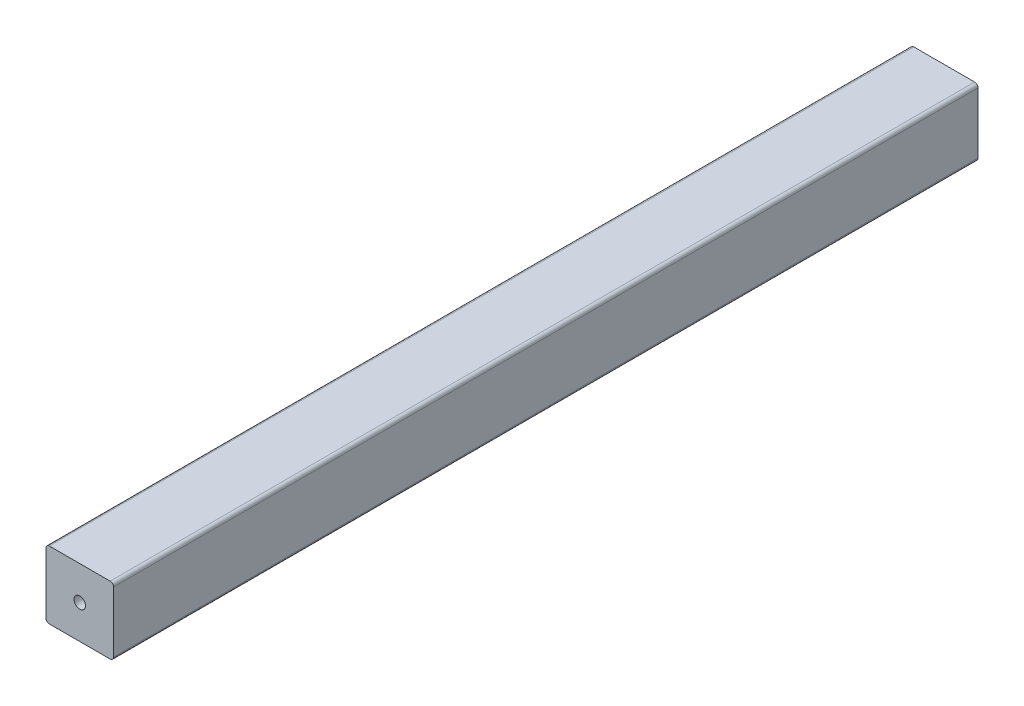
ISO-10303-21;
HEADER;
FILE_DESCRIPTION(('STEP AP214'),'2;1');
FILE_NAME('part.step','',(''),(''),'','','');
FILE_SCHEMA(('AUTOMOTIVE_DESIGN { 1 0 10303 214 1 1 1 1 }'));
ENDSEC;
DATA;
#1=APPLICATION_CONTEXT('core data for automotive mechanical design processes');
#2=APPLICATION_PROTOCOL_DEFINITION('international standard','automotive_design',2000,#1);
#3=PRODUCT_CONTEXT('',#1,'mechanical');
#4=PRODUCT('Part','Part','',(#3));
#5=PRODUCT_RELATED_PRODUCT_CATEGORY('part','',(#4));
#6=PRODUCT_DEFINITION_FORMATION('','',#4);
#7=PRODUCT_DEFINITION_CONTEXT('part definition',#1,'design');
#8=PRODUCT_DEFINITION('design','',#6,#7);
#9=PRODUCT_DEFINITION_SHAPE('','',#8);
#10=(LENGTH_UNIT() NAMED_UNIT(*) SI_UNIT(.MILLI.,.METRE.));
#11=(NAMED_UNIT(*) PLANE_ANGLE_UNIT() SI_UNIT($,.RADIAN.));
#12=(NAMED_UNIT(*) SI_UNIT($,.STERADIAN.) SOLID_ANGLE_UNIT());
#13=UNCERTAINTY_MEASURE_WITH_UNIT(LENGTH_MEASURE(1.E-05),#10,'distance_accuracy_value','');
#14=(GEOMETRIC_REPRESENTATION_CONTEXT(3) GLOBAL_UNCERTAINTY_ASSIGNED_CONTEXT((#13)) GLOBAL_UNIT_ASSIGNED_CONTEXT((#10,
#11,#12)) REPRESENTATION_CONTEXT('',''));
#15=CARTESIAN_POINT('',(0.,0.,0.));
#16=DIRECTION('',(0.,0.,1.));
#17=DIRECTION('',(1.,0.,0.));
#18=AXIS2_PLACEMENT_3D('',#15,#16,#17);
#19=CARTESIAN_POINT('',(0.,0.,256.));
#20=DIRECTION('',(0.,0.,-1.));
#21=DIRECTION('',(-1.,0.,0.));
#22=AXIS2_PLACEMENT_3D('',#19,#20,#21);
#23=PLANE('',#22);
#24=CARTESIAN_POINT('',(0.,0.,256.));
#25=DIRECTION('',(0.,0.,1.));
#26=DIRECTION('',(1.,0.,0.));
#27=AXIS2_PLACEMENT_3D('',#24,#25,#26);
#28=CIRCLE('',#27,3.39999999999999);
#29=CARTESIAN_POINT('',(3.39999999999999,0.,256.));
#30=VERTEX_POINT('',#29);
#31=EDGE_CURVE('E201',#30,#30,#28,.T.);
#32=ORIENTED_EDGE('',*,*,#31,.F.);
#33=EDGE_LOOP('',(#32));
#34=FACE_BOUND('',#33,.T.);
#35=DIRECTION('',(1.,0.,0.));
#36=VECTOR('',#35,1.);
#37=CARTESIAN_POINT('',(-20.,-20.,256.));
#38=LINE('',#37,#36);
#39=CARTESIAN_POINT('',(-18.,-20.,256.));
#40=VERTEX_POINT('',#39);
#41=CARTESIAN_POINT('',(18.,-20.,256.));
#42=VERTEX_POINT('',#41);
#43=EDGE_CURVE('E151',#40,#42,#38,.T.);
#44=ORIENTED_EDGE('',*,*,#43,.T.);
#45=CARTESIAN_POINT('',(18.,-18.,256.));
#46=DIRECTION('',(0.,0.,-1.));
#47=DIRECTION('',(-1.,0.,0.));
#48=AXIS2_PLACEMENT_3D('',#45,#46,#47);
#49=CIRCLE('',#48,2.);
#50=CARTESIAN_POINT('',(20.,-18.,256.));
#51=VERTEX_POINT('',#50);
#52=EDGE_CURVE('E173',#42,#51,#49,.F.);
#53=ORIENTED_EDGE('',*,*,#52,.T.);
#54=DIRECTION('',(0.,1.,0.));
#55=VECTOR('',#54,1.);
#56=CARTESIAN_POINT('',(20.,-20.,256.));
#57=LINE('',#56,#55);
#58=CARTESIAN_POINT('',(20.,18.,256.));
#59=VERTEX_POINT('',#58);
#60=EDGE_CURVE('E138',#51,#59,#57,.T.);
#61=ORIENTED_EDGE('',*,*,#60,.T.);
#62=CARTESIAN_POINT('',(18.,18.,256.));
#63=DIRECTION('',(0.,0.,-1.));
#64=DIRECTION('',(-1.,0.,0.));
#65=AXIS2_PLACEMENT_3D('',#62,#63,#64);
#66=CIRCLE('',#65,2.);
#67=CARTESIAN_POINT('',(18.,20.,256.));
#68=VERTEX_POINT('',#67);
#69=EDGE_CURVE('E166',#59,#68,#66,.F.);
#70=ORIENTED_EDGE('',*,*,#69,.T.);
#71=DIRECTION('',(-1.,0.,0.));
#72=VECTOR('',#71,1.);
#73=CARTESIAN_POINT('',(-20.,20.,256.));
#74=LINE('',#73,#72);
#75=CARTESIAN_POINT('',(-18.,20.,256.));
#76=VERTEX_POINT('',#75);
#77=EDGE_CURVE('E184',#68,#76,#74,.T.);
#78=ORIENTED_EDGE('',*,*,#77,.T.);
#79=CARTESIAN_POINT('',(-18.,18.,256.));
#80=DIRECTION('',(0.,0.,-1.));
#81=DIRECTION('',(-1.,0.,0.));
#82=AXIS2_PLACEMENT_3D('',#79,#80,#81);
#83=CIRCLE('',#82,2.);
#84=CARTESIAN_POINT('',(-20.,18.,256.));
#85=VERTEX_POINT('',#84);
#86=EDGE_CURVE('E75',#76,#85,#83,.F.);
#87=ORIENTED_EDGE('',*,*,#86,.T.);
#88=DIRECTION('',(0.,-1.,0.));
#89=VECTOR('',#88,1.);
#90=CARTESIAN_POINT('',(-20.,-20.,256.));
#91=LINE('',#90,#89);
#92=CARTESIAN_POINT('',(-20.,-18.,256.));
#93=VERTEX_POINT('',#92);
#94=EDGE_CURVE('E194',#85,#93,#91,.T.);
#95=ORIENTED_EDGE('',*,*,#94,.T.);
#96=CARTESIAN_POINT('',(-18.,-18.,256.));
#97=DIRECTION('',(0.,0.,-1.));
#98=DIRECTION('',(-1.,0.,0.));
#99=AXIS2_PLACEMENT_3D('',#96,#97,#98);
#100=CIRCLE('',#99,2.);
#101=EDGE_CURVE('E171',#93,#40,#100,.F.);
#102=ORIENTED_EDGE('',*,*,#101,.T.);
#103=EDGE_LOOP('',(#44,#53,#61,#70,#78,#87,#95,#102));
#104=FACE_BOUND('',#103,.T.);
#105=ADVANCED_FACE('F51',(#34,#104),#23,.F.);
#106=CARTESIAN_POINT('',(0.,0.,-256.));
#107=DIRECTION('',(0.,0.,-1.));
#108=DIRECTION('',(-1.,0.,0.));
#109=AXIS2_PLACEMENT_3D('',#106,#107,#108);
#110=PLANE('',#109);
#111=CARTESIAN_POINT('',(0.,0.,-256.));
#112=DIRECTION('',(0.,0.,-1.));
#113=DIRECTION('',(-1.,0.,0.));
#114=AXIS2_PLACEMENT_3D('',#111,#112,#113);
#115=CIRCLE('',#114,3.39999999999999);
#116=CARTESIAN_POINT('',(-3.39999999999999,0.,-256.));
#117=VERTEX_POINT('',#116);
#118=EDGE_CURVE('E210',#117,#117,#115,.T.);
#119=ORIENTED_EDGE('',*,*,#118,.F.);
#120=EDGE_LOOP('',(#119));
#121=FACE_BOUND('',#120,.T.);
#122=DIRECTION('',(0.,1.,0.));
#123=VECTOR('',#122,1.);
#124=CARTESIAN_POINT('',(20.,-20.,-256.));
#125=LINE('',#124,#123);
#126=CARTESIAN_POINT('',(20.,-18.,-256.));
#127=VERTEX_POINT('',#126);
#128=CARTESIAN_POINT('',(20.,18.,-256.));
#129=VERTEX_POINT('',#128);
#130=EDGE_CURVE('E136',#127,#129,#125,.T.);
#131=ORIENTED_EDGE('',*,*,#130,.F.);
#132=CARTESIAN_POINT('',(18.,-18.,-256.));
#133=DIRECTION('',(0.,0.,-1.));
#134=DIRECTION('',(-1.,0.,0.));
#135=AXIS2_PLACEMENT_3D('',#132,#133,#134);
#136=CIRCLE('',#135,2.);
#137=CARTESIAN_POINT('',(18.,-20.,-256.));
#138=VERTEX_POINT('',#137);
#139=EDGE_CURVE('E118',#127,#138,#136,.T.);
#140=ORIENTED_EDGE('',*,*,#139,.T.);
#141=DIRECTION('',(1.,0.,0.));
#142=VECTOR('',#141,1.);
#143=CARTESIAN_POINT('',(-20.,-20.,-256.));
#144=LINE('',#143,#142);
#145=CARTESIAN_POINT('',(-18.,-20.,-256.));
#146=VERTEX_POINT('',#145);
#147=EDGE_CURVE('E159',#146,#138,#144,.T.);
#148=ORIENTED_EDGE('',*,*,#147,.F.);
#149=CARTESIAN_POINT('',(-18.,-18.,-256.));
#150=DIRECTION('',(0.,0.,-1.));
#151=DIRECTION('',(-1.,0.,0.));
#152=AXIS2_PLACEMENT_3D('',#149,#150,#151);
#153=CIRCLE('',#152,2.);
#154=CARTESIAN_POINT('',(-20.,-18.,-256.));
#155=VERTEX_POINT('',#154);
#156=EDGE_CURVE('E128',#146,#155,#153,.T.);
#157=ORIENTED_EDGE('',*,*,#156,.T.);
#158=DIRECTION('',(0.,-1.,0.));
#159=VECTOR('',#158,1.);
#160=CARTESIAN_POINT('',(-20.,-20.,-256.));
#161=LINE('',#160,#159);
#162=CARTESIAN_POINT('',(-20.,18.,-256.));
#163=VERTEX_POINT('',#162);
#164=EDGE_CURVE('E146',#163,#155,#161,.T.);
#165=ORIENTED_EDGE('',*,*,#164,.F.);
#166=CARTESIAN_POINT('',(-18.,18.,-256.));
#167=DIRECTION('',(0.,0.,-1.));
#168=DIRECTION('',(-1.,0.,0.));
#169=AXIS2_PLACEMENT_3D('',#166,#167,#168);
#170=CIRCLE('',#169,2.);
#171=CARTESIAN_POINT('',(-18.,20.,-256.));
#172=VERTEX_POINT('',#171);
#173=EDGE_CURVE('E162',#163,#172,#170,.T.);
#174=ORIENTED_EDGE('',*,*,#173,.T.);
#175=DIRECTION('',(-1.,0.,0.));
#176=VECTOR('',#175,1.);
#177=CARTESIAN_POINT('',(-20.,20.,-256.));
#178=LINE('',#177,#176);
#179=CARTESIAN_POINT('',(18.,20.,-256.));
#180=VERTEX_POINT('',#179);
#181=EDGE_CURVE('E143',#180,#172,#178,.T.);
#182=ORIENTED_EDGE('',*,*,#181,.F.);
#183=CARTESIAN_POINT('',(18.,18.,-256.));
#184=DIRECTION('',(0.,0.,-1.));
#185=DIRECTION('',(-1.,0.,0.));
#186=AXIS2_PLACEMENT_3D('',#183,#184,#185);
#187=CIRCLE('',#186,2.);
#188=EDGE_CURVE('E140',#180,#129,#187,.T.);
#189=ORIENTED_EDGE('',*,*,#188,.T.);
#190=EDGE_LOOP('',(#131,#140,#148,#157,#165,#174,#182,#189));
#191=FACE_BOUND('',#190,.T.);
#192=ADVANCED_FACE('F141',(#121,#191),#110,.T.);
#193=CARTESIAN_POINT('',(20.,-20.,256.));
#194=DIRECTION('',(-1.,0.,0.));
#195=DIRECTION('',(0.,0.,1.));
#196=AXIS2_PLACEMENT_3D('',#193,#194,#195);
#197=PLANE('',#196);
#198=ORIENTED_EDGE('',*,*,#60,.F.);
#199=DIRECTION('',(0.,0.,-1.));
#200=VECTOR('',#199,1.);
#201=CARTESIAN_POINT('',(20.,-18.,256.));
#202=LINE('',#201,#200);
#203=EDGE_CURVE('E124',#51,#127,#202,.T.);
#204=ORIENTED_EDGE('',*,*,#203,.T.);
#205=ORIENTED_EDGE('',*,*,#130,.T.);
#206=DIRECTION('',(0.,0.,-1.));
#207=VECTOR('',#206,1.);
#208=CARTESIAN_POINT('',(20.,18.,256.));
#209=LINE('',#208,#207);
#210=EDGE_CURVE('E142',#129,#59,#209,.F.);
#211=ORIENTED_EDGE('',*,*,#210,.T.);
#212=EDGE_LOOP('',(#198,#204,#205,#211));
#213=FACE_BOUND('',#212,.T.);
#214=ADVANCED_FACE('F133',(#213),#197,.F.);
#215=CARTESIAN_POINT('',(-20.,20.,256.));
#216=DIRECTION('',(0.,-1.,0.));
#217=DIRECTION('',(0.,0.,-1.));
#218=AXIS2_PLACEMENT_3D('',#215,#216,#217);
#219=PLANE('',#218);
#220=ORIENTED_EDGE('',*,*,#181,.T.);
#221=DIRECTION('',(0.,0.,-1.));
#222=VECTOR('',#221,1.);
#223=CARTESIAN_POINT('',(-18.,20.,256.));
#224=LINE('',#223,#222);
#225=EDGE_CURVE('E11',#172,#76,#224,.F.);
#226=ORIENTED_EDGE('',*,*,#225,.T.);
#227=ORIENTED_EDGE('',*,*,#77,.F.);
#228=DIRECTION('',(0.,0.,-1.));
#229=VECTOR('',#228,1.);
#230=CARTESIAN_POINT('',(18.,20.,256.));
#231=LINE('',#230,#229);
#232=EDGE_CURVE('E58',#68,#180,#231,.T.);
#233=ORIENTED_EDGE('',*,*,#232,.T.);
#234=EDGE_LOOP('',(#220,#226,#227,#233));
#235=FACE_BOUND('',#234,.T.);
#236=ADVANCED_FACE('F182',(#235),#219,.F.);
#237=CARTESIAN_POINT('',(-20.,-20.,256.));
#238=DIRECTION('',(1.,0.,0.));
#239=DIRECTION('',(0.,0.,-1.));
#240=AXIS2_PLACEMENT_3D('',#237,#238,#239);
#241=PLANE('',#240);
#242=ORIENTED_EDGE('',*,*,#164,.T.);
#243=DIRECTION('',(0.,0.,-1.));
#244=VECTOR('',#243,1.);
#245=CARTESIAN_POINT('',(-20.,-18.,256.));
#246=LINE('',#245,#244);
#247=EDGE_CURVE('E70',#155,#93,#246,.F.);
#248=ORIENTED_EDGE('',*,*,#247,.T.);
#249=ORIENTED_EDGE('',*,*,#94,.F.);
#250=DIRECTION('',(0.,0.,-1.));
#251=VECTOR('',#250,1.);
#252=CARTESIAN_POINT('',(-20.,18.,256.));
#253=LINE('',#252,#251);
#254=EDGE_CURVE('E174',#85,#163,#253,.T.);
#255=ORIENTED_EDGE('',*,*,#254,.T.);
#256=EDGE_LOOP('',(#242,#248,#249,#255));
#257=FACE_BOUND('',#256,.T.);
#258=ADVANCED_FACE('F195',(#257),#241,.F.);
#259=CARTESIAN_POINT('',(-20.,-20.,256.));
#260=DIRECTION('',(0.,1.,0.));
#261=DIRECTION('',(0.,0.,1.));
#262=AXIS2_PLACEMENT_3D('',#259,#260,#261);
#263=PLANE('',#262);
#264=ORIENTED_EDGE('',*,*,#147,.T.);
#265=DIRECTION('',(0.,0.,-1.));
#266=VECTOR('',#265,1.);
#267=CARTESIAN_POINT('',(18.,-20.,256.));
#268=LINE('',#267,#266);
#269=EDGE_CURVE('E121',#138,#42,#268,.F.);
#270=ORIENTED_EDGE('',*,*,#269,.T.);
#271=ORIENTED_EDGE('',*,*,#43,.F.);
#272=DIRECTION('',(0.,0.,-1.));
#273=VECTOR('',#272,1.);
#274=CARTESIAN_POINT('',(-18.,-20.,256.));
#275=LINE('',#274,#273);
#276=EDGE_CURVE('E126',#40,#146,#275,.T.);
#277=ORIENTED_EDGE('',*,*,#276,.T.);
#278=EDGE_LOOP('',(#264,#270,#271,#277));
#279=FACE_BOUND('',#278,.T.);
#280=ADVANCED_FACE('F223',(#279),#263,.F.);
#281=CARTESIAN_POINT('',(0.,0.,256.));
#282=DIRECTION('',(0.,0.,-1.));
#283=DIRECTION('',(-1.,0.,0.));
#284=AXIS2_PLACEMENT_3D('',#281,#282,#283);
#285=CYLINDRICAL_SURFACE('',#284,2.5);
#286=CARTESIAN_POINT('',(0.,0.,-227.709225442875));
#287=DIRECTION('',(0.,0.,-1.));
#288=DIRECTION('',(-1.,0.,0.));
#289=AXIS2_PLACEMENT_3D('',#286,#287,#288);
#290=CIRCLE('',#289,2.5);
#291=CARTESIAN_POINT('',(-2.5,0.,-227.709225442875));
#292=VERTEX_POINT('',#291);
#293=EDGE_CURVE('E54',#292,#292,#290,.F.);
#294=ORIENTED_EDGE('',*,*,#293,.F.);
#295=EDGE_LOOP('',(#294));
#296=FACE_BOUND('',#295,.T.);
#297=CARTESIAN_POINT('',(0.,0.,227.709225442875));
#298=DIRECTION('',(0.,0.,1.));
#299=DIRECTION('',(1.,0.,0.));
#300=AXIS2_PLACEMENT_3D('',#297,#298,#299);
#301=CIRCLE('',#300,2.5);
#302=CARTESIAN_POINT('',(2.5,0.,227.709225442875));
#303=VERTEX_POINT('',#302);
#304=EDGE_CURVE('E147',#303,#303,#301,.F.);
#305=ORIENTED_EDGE('',*,*,#304,.F.);
#306=EDGE_LOOP('',(#305));
#307=FACE_BOUND('',#306,.T.);
#308=ADVANCED_FACE('F227',(#296,#307),#285,.F.);
#309=CARTESIAN_POINT('',(18.,-18.,256.));
#310=DIRECTION('',(0.,0.,-1.));
#311=DIRECTION('',(-1.,0.,0.));
#312=AXIS2_PLACEMENT_3D('',#309,#310,#311);
#313=CYLINDRICAL_SURFACE('',#312,2.);
#314=ORIENTED_EDGE('',*,*,#52,.F.);
#315=ORIENTED_EDGE('',*,*,#269,.F.);
#316=ORIENTED_EDGE('',*,*,#139,.F.);
#317=ORIENTED_EDGE('',*,*,#203,.F.);
#318=EDGE_LOOP('',(#314,#315,#316,#317));
#319=FACE_BOUND('',#318,.T.);
#320=ADVANCED_FACE('F125',(#319),#313,.T.);
#321=CARTESIAN_POINT('',(-18.,-18.,256.));
#322=DIRECTION('',(0.,0.,-1.));
#323=DIRECTION('',(-1.,0.,0.));
#324=AXIS2_PLACEMENT_3D('',#321,#322,#323);
#325=CYLINDRICAL_SURFACE('',#324,2.);
#326=ORIENTED_EDGE('',*,*,#101,.F.);
#327=ORIENTED_EDGE('',*,*,#247,.F.);
#328=ORIENTED_EDGE('',*,*,#156,.F.);
#329=ORIENTED_EDGE('',*,*,#276,.F.);
#330=EDGE_LOOP('',(#326,#327,#328,#329));
#331=FACE_BOUND('',#330,.T.);
#332=ADVANCED_FACE('F232',(#331),#325,.T.);
#333=CARTESIAN_POINT('',(-18.,18.,256.));
#334=DIRECTION('',(0.,0.,-1.));
#335=DIRECTION('',(-1.,0.,0.));
#336=AXIS2_PLACEMENT_3D('',#333,#334,#335);
#337=CYLINDRICAL_SURFACE('',#336,2.);
#338=ORIENTED_EDGE('',*,*,#86,.F.);
#339=ORIENTED_EDGE('',*,*,#225,.F.);
#340=ORIENTED_EDGE('',*,*,#173,.F.);
#341=ORIENTED_EDGE('',*,*,#254,.F.);
#342=EDGE_LOOP('',(#338,#339,#340,#341));
#343=FACE_BOUND('',#342,.T.);
#344=ADVANCED_FACE('F192',(#343),#337,.T.);
#345=CARTESIAN_POINT('',(18.,18.,256.));
#346=DIRECTION('',(0.,0.,-1.));
#347=DIRECTION('',(-1.,0.,0.));
#348=AXIS2_PLACEMENT_3D('',#345,#346,#347);
#349=CYLINDRICAL_SURFACE('',#348,2.);
#350=ORIENTED_EDGE('',*,*,#69,.F.);
#351=ORIENTED_EDGE('',*,*,#210,.F.);
#352=ORIENTED_EDGE('',*,*,#188,.F.);
#353=ORIENTED_EDGE('',*,*,#232,.F.);
#354=EDGE_LOOP('',(#350,#351,#352,#353));
#355=FACE_BOUND('',#354,.T.);
#356=ADVANCED_FACE('F52',(#355),#349,.T.);
#357=CARTESIAN_POINT('',(0.,0.,228.25));
#358=DIRECTION('',(0.,0.,1.));
#359=DIRECTION('',(1.,0.,0.));
#360=AXIS2_PLACEMENT_3D('',#357,#358,#359);
#361=CONICAL_SURFACE('',#360,3.3999999999997,1.02974425867665);
#362=ORIENTED_EDGE('',*,*,#304,.T.);
#363=EDGE_LOOP('',(#362));
#364=FACE_BOUND('',#363,.T.);
#365=CARTESIAN_POINT('',(0.,0.,228.25));
#366=DIRECTION('',(0.,0.,1.));
#367=DIRECTION('',(1.,0.,0.));
#368=AXIS2_PLACEMENT_3D('',#365,#366,#367);
#369=CIRCLE('',#368,3.3999999999997);
#370=CARTESIAN_POINT('',(3.3999999999997,0.,228.25));
#371=VERTEX_POINT('',#370);
#372=EDGE_CURVE('E154',#371,#371,#369,.T.);
#373=ORIENTED_EDGE('',*,*,#372,.T.);
#374=EDGE_LOOP('',(#373));
#375=FACE_BOUND('',#374,.T.);
#376=ADVANCED_FACE('F245',(#364,#375),#361,.F.);
#377=CARTESIAN_POINT('',(0.,0.,256.));
#378=DIRECTION('',(0.,0.,1.));
#379=DIRECTION('',(1.,0.,0.));
#380=AXIS2_PLACEMENT_3D('',#377,#378,#379);
#381=CYLINDRICAL_SURFACE('',#380,3.39999999999985);
#382=ORIENTED_EDGE('',*,*,#372,.F.);
#383=EDGE_LOOP('',(#382));
#384=FACE_BOUND('',#383,.T.);
#385=ORIENTED_EDGE('',*,*,#31,.T.);
#386=EDGE_LOOP('',(#385));
#387=FACE_BOUND('',#386,.T.);
#388=ADVANCED_FACE('F250',(#384,#387),#381,.F.);
#389=CARTESIAN_POINT('',(0.,0.,-228.25));
#390=DIRECTION('',(0.,0.,-1.));
#391=DIRECTION('',(-1.,0.,0.));
#392=AXIS2_PLACEMENT_3D('',#389,#390,#391);
#393=CONICAL_SURFACE('',#392,3.3999999999997,1.02974425867665);
#394=ORIENTED_EDGE('',*,*,#293,.T.);
#395=EDGE_LOOP('',(#394));
#396=FACE_BOUND('',#395,.T.);
#397=CARTESIAN_POINT('',(0.,0.,-228.25));
#398=DIRECTION('',(0.,0.,-1.));
#399=DIRECTION('',(-1.,0.,0.));
#400=AXIS2_PLACEMENT_3D('',#397,#398,#399);
#401=CIRCLE('',#400,3.3999999999997);
#402=CARTESIAN_POINT('',(-3.3999999999997,0.,-228.25));
#403=VERTEX_POINT('',#402);
#404=EDGE_CURVE('E203',#403,#403,#401,.T.);
#405=ORIENTED_EDGE('',*,*,#404,.T.);
#406=EDGE_LOOP('',(#405));
#407=FACE_BOUND('',#406,.T.);
#408=ADVANCED_FACE('F257',(#396,#407),#393,.F.);
#409=CARTESIAN_POINT('',(0.,0.,-256.));
#410=DIRECTION('',(0.,0.,-1.));
#411=DIRECTION('',(-1.,0.,0.));
#412=AXIS2_PLACEMENT_3D('',#409,#410,#411);
#413=CYLINDRICAL_SURFACE('',#412,3.39999999999985);
#414=ORIENTED_EDGE('',*,*,#404,.F.);
#415=EDGE_LOOP('',(#414));
#416=FACE_BOUND('',#415,.T.);
#417=ORIENTED_EDGE('',*,*,#118,.T.);
#418=EDGE_LOOP('',(#417));
#419=FACE_BOUND('',#418,.T.);
#420=ADVANCED_FACE('F212',(#416,#419),#413,.F.);
#421=CLOSED_SHELL('',(#105,#192,#214,#236,#258,#280,#308,#320,#332,#344,#356,#376,#388,#408,#420));
#422=MANIFOLD_SOLID_BREP('B2',#421);
#423=ADVANCED_BREP_SHAPE_REPRESENTATION('',(#18,#422),#14);
#424=SHAPE_DEFINITION_REPRESENTATION(#9,#423);
ENDSEC;
END-ISO-10303-21;
